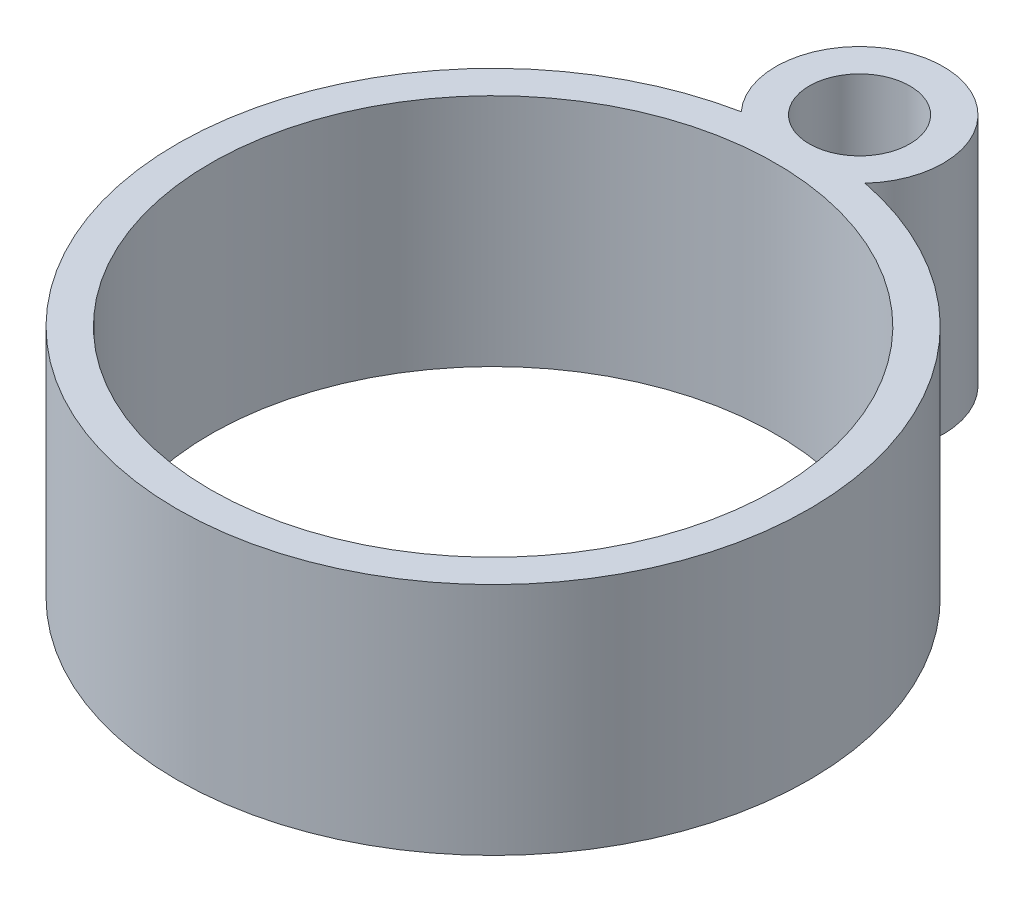
ISO-10303-21;
HEADER;
FILE_DESCRIPTION(('STEP AP214'),'2;1');
FILE_NAME('part.step','',(''),(''),'','','');
FILE_SCHEMA(('AUTOMOTIVE_DESIGN { 1 0 10303 214 1 1 1 1 }'));
ENDSEC;
DATA;
#1=APPLICATION_CONTEXT('core data for automotive mechanical design processes');
#2=APPLICATION_PROTOCOL_DEFINITION('international standard','automotive_design',2000,#1);
#3=PRODUCT_CONTEXT('',#1,'mechanical');
#4=PRODUCT('Part','Part','',(#3));
#5=PRODUCT_RELATED_PRODUCT_CATEGORY('part','',(#4));
#6=PRODUCT_DEFINITION_FORMATION('','',#4);
#7=PRODUCT_DEFINITION_CONTEXT('part definition',#1,'design');
#8=PRODUCT_DEFINITION('design','',#6,#7);
#9=PRODUCT_DEFINITION_SHAPE('','',#8);
#10=(LENGTH_UNIT() NAMED_UNIT(*) SI_UNIT(.MILLI.,.METRE.));
#11=(NAMED_UNIT(*) PLANE_ANGLE_UNIT() SI_UNIT($,.RADIAN.));
#12=(NAMED_UNIT(*) SI_UNIT($,.STERADIAN.) SOLID_ANGLE_UNIT());
#13=UNCERTAINTY_MEASURE_WITH_UNIT(LENGTH_MEASURE(1.E-05),#10,'distance_accuracy_value','');
#14=(GEOMETRIC_REPRESENTATION_CONTEXT(3) GLOBAL_UNCERTAINTY_ASSIGNED_CONTEXT((#13)) GLOBAL_UNIT_ASSIGNED_CONTEXT((#10,
#11,#12)) REPRESENTATION_CONTEXT('',''));
#15=CARTESIAN_POINT('',(0.,0.,0.));
#16=DIRECTION('',(0.,0.,1.));
#17=DIRECTION('',(1.,0.,0.));
#18=AXIS2_PLACEMENT_3D('',#15,#16,#17);
#19=CARTESIAN_POINT('',(0.,7.,0.));
#20=DIRECTION('',(0.,-1.,0.));
#21=DIRECTION('',(0.,0.,-1.));
#22=AXIS2_PLACEMENT_3D('',#19,#20,#21);
#23=CYLINDRICAL_SURFACE('',#22,9.435);
#24=CARTESIAN_POINT('',(0.,0.,0.));
#25=DIRECTION('',(0.,1.,0.));
#26=DIRECTION('',(0.,0.,1.));
#27=AXIS2_PLACEMENT_3D('',#24,#25,#26);
#28=CIRCLE('',#27,9.435);
#29=CARTESIAN_POINT('',(-1.84874312161162,0.,-9.25210105166896));
#30=VERTEX_POINT('',#29);
#31=CARTESIAN_POINT('',(1.84874312161162,0.,-9.25210105166896));
#32=VERTEX_POINT('',#31);
#33=EDGE_CURVE('E81',#30,#32,#28,.T.);
#34=ORIENTED_EDGE('',*,*,#33,.T.);
#35=DIRECTION('',(0.,-1.,0.));
#36=VECTOR('',#35,1.);
#37=CARTESIAN_POINT('',(1.84874312161162,7.,-9.25210105166896));
#38=LINE('',#37,#36);
#39=CARTESIAN_POINT('',(1.84874312161162,7.,-9.25210105166896));
#40=VERTEX_POINT('',#39);
#41=EDGE_CURVE('E11',#40,#32,#38,.T.);
#42=ORIENTED_EDGE('',*,*,#41,.F.);
#43=CARTESIAN_POINT('',(0.,7.,0.));
#44=DIRECTION('',(0.,1.,0.));
#45=DIRECTION('',(0.,0.,1.));
#46=AXIS2_PLACEMENT_3D('',#43,#44,#45);
#47=CIRCLE('',#46,9.435);
#48=CARTESIAN_POINT('',(-1.84874312161162,7.,-9.25210105166896));
#49=VERTEX_POINT('',#48);
#50=EDGE_CURVE('E84',#49,#40,#47,.T.);
#51=ORIENTED_EDGE('',*,*,#50,.F.);
#52=DIRECTION('',(0.,-1.,0.));
#53=VECTOR('',#52,1.);
#54=CARTESIAN_POINT('',(-1.84874312161162,7.,-9.25210105166896));
#55=LINE('',#54,#53);
#56=EDGE_CURVE('E57',#49,#30,#55,.T.);
#57=ORIENTED_EDGE('',*,*,#56,.T.);
#58=EDGE_LOOP('',(#34,#42,#51,#57));
#59=FACE_BOUND('',#58,.T.);
#60=ADVANCED_FACE('F47',(#59),#23,.T.);
#61=CARTESIAN_POINT('',(0.,7.,-10.935));
#62=DIRECTION('',(0.,-1.,0.));
#63=DIRECTION('',(0.,0.,-1.));
#64=AXIS2_PLACEMENT_3D('',#61,#62,#63);
#65=CYLINDRICAL_SURFACE('',#64,2.5);
#66=CARTESIAN_POINT('',(0.,0.,-10.935));
#67=DIRECTION('',(0.,1.,0.));
#68=DIRECTION('',(0.,0.,1.));
#69=AXIS2_PLACEMENT_3D('',#66,#67,#68);
#70=CIRCLE('',#69,2.5);
#71=EDGE_CURVE('E72',#32,#30,#70,.T.);
#72=ORIENTED_EDGE('',*,*,#71,.T.);
#73=ORIENTED_EDGE('',*,*,#56,.F.);
#74=CARTESIAN_POINT('',(0.,7.,-10.935));
#75=DIRECTION('',(0.,1.,0.));
#76=DIRECTION('',(0.,0.,1.));
#77=AXIS2_PLACEMENT_3D('',#74,#75,#76);
#78=CIRCLE('',#77,2.5);
#79=EDGE_CURVE('E64',#40,#49,#78,.T.);
#80=ORIENTED_EDGE('',*,*,#79,.F.);
#81=ORIENTED_EDGE('',*,*,#41,.T.);
#82=EDGE_LOOP('',(#72,#73,#80,#81));
#83=FACE_BOUND('',#82,.T.);
#84=ADVANCED_FACE('F75',(#83),#65,.T.);
#85=CARTESIAN_POINT('',(0.,7.,-10.935));
#86=DIRECTION('',(0.,-1.,0.));
#87=DIRECTION('',(0.,0.,-1.));
#88=AXIS2_PLACEMENT_3D('',#85,#86,#87);
#89=CYLINDRICAL_SURFACE('',#88,1.5);
#90=CARTESIAN_POINT('',(0.,7.,-10.935));
#91=DIRECTION('',(0.,1.,0.));
#92=DIRECTION('',(0.,0.,1.));
#93=AXIS2_PLACEMENT_3D('',#90,#91,#92);
#94=CIRCLE('',#93,1.5);
#95=CARTESIAN_POINT('',(0.,7.,-9.435));
#96=VERTEX_POINT('',#95);
#97=EDGE_CURVE('E99',#96,#96,#94,.T.);
#98=ORIENTED_EDGE('',*,*,#97,.T.);
#99=EDGE_LOOP('',(#98));
#100=FACE_BOUND('',#99,.T.);
#101=CARTESIAN_POINT('',(0.,0.,-10.935));
#102=DIRECTION('',(0.,1.,0.));
#103=DIRECTION('',(0.,0.,1.));
#104=AXIS2_PLACEMENT_3D('',#101,#102,#103);
#105=CIRCLE('',#104,1.5);
#106=CARTESIAN_POINT('',(0.,0.,-9.435));
#107=VERTEX_POINT('',#106);
#108=EDGE_CURVE('E90',#107,#107,#105,.T.);
#109=ORIENTED_EDGE('',*,*,#108,.F.);
#110=EDGE_LOOP('',(#109));
#111=FACE_BOUND('',#110,.T.);
#112=ADVANCED_FACE('F49',(#100,#111),#89,.F.);
#113=CARTESIAN_POINT('',(0.,7.,0.));
#114=DIRECTION('',(0.,-1.,0.));
#115=DIRECTION('',(0.,0.,-1.));
#116=AXIS2_PLACEMENT_3D('',#113,#114,#115);
#117=CYLINDRICAL_SURFACE('',#116,8.435);
#118=CARTESIAN_POINT('',(0.,7.,0.));
#119=DIRECTION('',(0.,1.,0.));
#120=DIRECTION('',(0.,0.,1.));
#121=AXIS2_PLACEMENT_3D('',#118,#119,#120);
#122=CIRCLE('',#121,8.435);
#123=CARTESIAN_POINT('',(0.,7.,8.435));
#124=VERTEX_POINT('',#123);
#125=EDGE_CURVE('E86',#124,#124,#122,.T.);
#126=ORIENTED_EDGE('',*,*,#125,.T.);
#127=EDGE_LOOP('',(#126));
#128=FACE_BOUND('',#127,.T.);
#129=CARTESIAN_POINT('',(0.,0.,0.));
#130=DIRECTION('',(0.,1.,0.));
#131=DIRECTION('',(0.,0.,1.));
#132=AXIS2_PLACEMENT_3D('',#129,#130,#131);
#133=CIRCLE('',#132,8.435);
#134=CARTESIAN_POINT('',(0.,0.,8.435));
#135=VERTEX_POINT('',#134);
#136=EDGE_CURVE('E80',#135,#135,#133,.T.);
#137=ORIENTED_EDGE('',*,*,#136,.F.);
#138=EDGE_LOOP('',(#137));
#139=FACE_BOUND('',#138,.T.);
#140=ADVANCED_FACE('F114',(#128,#139),#117,.F.);
#141=CARTESIAN_POINT('',(0.,7.,0.));
#142=DIRECTION('',(0.,1.,0.));
#143=DIRECTION('',(0.,0.,1.));
#144=AXIS2_PLACEMENT_3D('',#141,#142,#143);
#145=PLANE('',#144);
#146=ORIENTED_EDGE('',*,*,#97,.F.);
#147=EDGE_LOOP('',(#146));
#148=FACE_BOUND('',#147,.T.);
#149=ORIENTED_EDGE('',*,*,#50,.T.);
#150=ORIENTED_EDGE('',*,*,#79,.T.);
#151=EDGE_LOOP('',(#149,#150));
#152=FACE_BOUND('',#151,.T.);
#153=ORIENTED_EDGE('',*,*,#125,.F.);
#154=EDGE_LOOP('',(#153));
#155=FACE_BOUND('',#154,.T.);
#156=ADVANCED_FACE('F117',(#148,#152,#155),#145,.T.);
#157=CARTESIAN_POINT('',(0.,0.,0.));
#158=DIRECTION('',(0.,1.,0.));
#159=DIRECTION('',(0.,0.,1.));
#160=AXIS2_PLACEMENT_3D('',#157,#158,#159);
#161=PLANE('',#160);
#162=ORIENTED_EDGE('',*,*,#108,.T.);
#163=EDGE_LOOP('',(#162));
#164=FACE_BOUND('',#163,.T.);
#165=ORIENTED_EDGE('',*,*,#33,.F.);
#166=ORIENTED_EDGE('',*,*,#71,.F.);
#167=EDGE_LOOP('',(#165,#166));
#168=FACE_BOUND('',#167,.T.);
#169=ORIENTED_EDGE('',*,*,#136,.T.);
#170=EDGE_LOOP('',(#169));
#171=FACE_BOUND('',#170,.T.);
#172=ADVANCED_FACE('F87',(#164,#168,#171),#161,.F.);
#173=CLOSED_SHELL('',(#60,#84,#112,#140,#156,#172));
#174=MANIFOLD_SOLID_BREP('B2',#173);
#175=ADVANCED_BREP_SHAPE_REPRESENTATION('',(#18,#174),#14);
#176=SHAPE_DEFINITION_REPRESENTATION(#9,#175);
ENDSEC;
END-ISO-10303-21;
